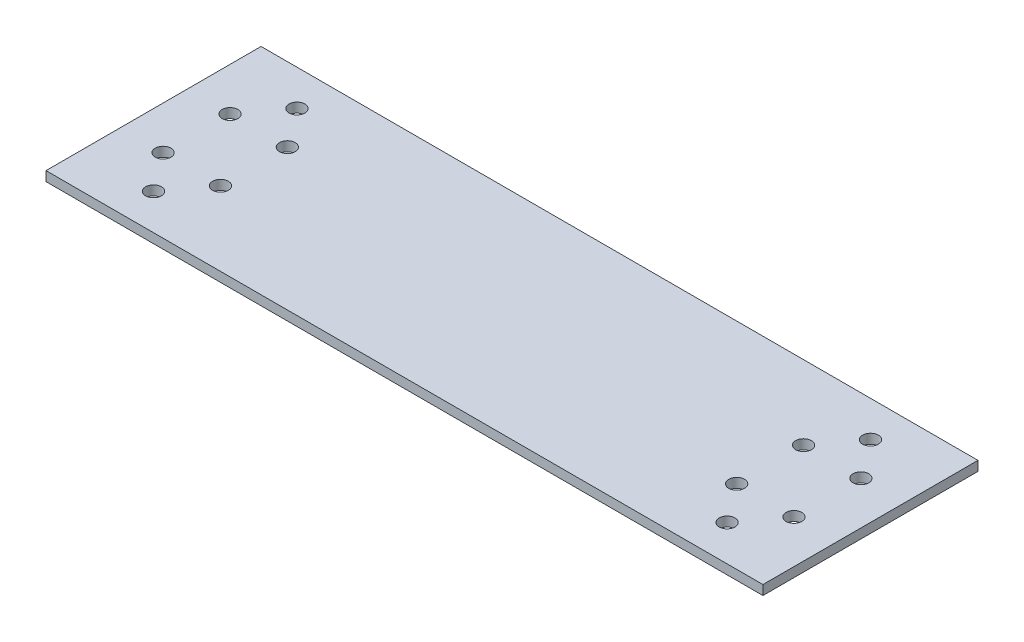
ISO-10303-21;
HEADER;
FILE_DESCRIPTION(('STEP AP214'),'2;1');
FILE_NAME('part.step','',(''),(''),'','','');
FILE_SCHEMA(('AUTOMOTIVE_DESIGN { 1 0 10303 214 1 1 1 1 }'));
ENDSEC;
DATA;
#1=APPLICATION_CONTEXT('core data for automotive mechanical design processes');
#2=APPLICATION_PROTOCOL_DEFINITION('international standard','automotive_design',2000,#1);
#3=PRODUCT_CONTEXT('',#1,'mechanical');
#4=PRODUCT('Part','Part','',(#3));
#5=PRODUCT_RELATED_PRODUCT_CATEGORY('part','',(#4));
#6=PRODUCT_DEFINITION_FORMATION('','',#4);
#7=PRODUCT_DEFINITION_CONTEXT('part definition',#1,'design');
#8=PRODUCT_DEFINITION('design','',#6,#7);
#9=PRODUCT_DEFINITION_SHAPE('','',#8);
#10=(LENGTH_UNIT() NAMED_UNIT(*) SI_UNIT(.MILLI.,.METRE.));
#11=(NAMED_UNIT(*) PLANE_ANGLE_UNIT() SI_UNIT($,.RADIAN.));
#12=(NAMED_UNIT(*) SI_UNIT($,.STERADIAN.) SOLID_ANGLE_UNIT());
#13=UNCERTAINTY_MEASURE_WITH_UNIT(LENGTH_MEASURE(1.E-05),#10,'distance_accuracy_value','');
#14=(GEOMETRIC_REPRESENTATION_CONTEXT(3) GLOBAL_UNCERTAINTY_ASSIGNED_CONTEXT((#13)) GLOBAL_UNIT_ASSIGNED_CONTEXT((#10,
#11,#12)) REPRESENTATION_CONTEXT('',''));
#15=CARTESIAN_POINT('',(0.,0.,0.));
#16=DIRECTION('',(0.,0.,1.));
#17=DIRECTION('',(1.,0.,0.));
#18=AXIS2_PLACEMENT_3D('',#15,#16,#17);
#19=CARTESIAN_POINT('',(75.,2.,22.5));
#20=DIRECTION('',(-1.,0.,0.));
#21=DIRECTION('',(0.,0.,1.));
#22=AXIS2_PLACEMENT_3D('',#19,#20,#21);
#23=PLANE('',#22);
#24=DIRECTION('',(0.,0.,-1.));
#25=VECTOR('',#24,1.);
#26=CARTESIAN_POINT('',(75.,0.,22.5));
#27=LINE('',#26,#25);
#28=CARTESIAN_POINT('',(75.,0.,22.5));
#29=VERTEX_POINT('',#28);
#30=CARTESIAN_POINT('',(75.,0.,-22.5));
#31=VERTEX_POINT('',#30);
#32=EDGE_CURVE('E98',#29,#31,#27,.T.);
#33=ORIENTED_EDGE('',*,*,#32,.T.);
#34=DIRECTION('',(0.,-1.,0.));
#35=VECTOR('',#34,1.);
#36=CARTESIAN_POINT('',(75.,2.,-22.5));
#37=LINE('',#36,#35);
#38=CARTESIAN_POINT('',(75.,2.,-22.5));
#39=VERTEX_POINT('',#38);
#40=EDGE_CURVE('E11',#39,#31,#37,.T.);
#41=ORIENTED_EDGE('',*,*,#40,.F.);
#42=DIRECTION('',(0.,0.,-1.));
#43=VECTOR('',#42,1.);
#44=CARTESIAN_POINT('',(75.,2.,22.5));
#45=LINE('',#44,#43);
#46=CARTESIAN_POINT('',(75.,2.,22.5));
#47=VERTEX_POINT('',#46);
#48=EDGE_CURVE('E86',#47,#39,#45,.T.);
#49=ORIENTED_EDGE('',*,*,#48,.F.);
#50=DIRECTION('',(0.,-1.,0.));
#51=VECTOR('',#50,1.);
#52=CARTESIAN_POINT('',(75.,2.,22.5));
#53=LINE('',#52,#51);
#54=EDGE_CURVE('E94',#47,#29,#53,.T.);
#55=ORIENTED_EDGE('',*,*,#54,.T.);
#56=EDGE_LOOP('',(#33,#41,#49,#55));
#57=FACE_BOUND('',#56,.T.);
#58=ADVANCED_FACE('F35',(#57),#23,.F.);
#59=CARTESIAN_POINT('',(-75.,2.,-22.5));
#60=DIRECTION('',(0.,0.,1.));
#61=DIRECTION('',(1.,0.,0.));
#62=AXIS2_PLACEMENT_3D('',#59,#60,#61);
#63=PLANE('',#62);
#64=DIRECTION('',(-1.,0.,0.));
#65=VECTOR('',#64,1.);
#66=CARTESIAN_POINT('',(-75.,0.,-22.5));
#67=LINE('',#66,#65);
#68=CARTESIAN_POINT('',(-75.,0.,-22.5));
#69=VERTEX_POINT('',#68);
#70=EDGE_CURVE('E90',#31,#69,#67,.T.);
#71=ORIENTED_EDGE('',*,*,#70,.T.);
#72=DIRECTION('',(0.,-1.,0.));
#73=VECTOR('',#72,1.);
#74=CARTESIAN_POINT('',(-75.,2.,-22.5));
#75=LINE('',#74,#73);
#76=CARTESIAN_POINT('',(-75.,2.,-22.5));
#77=VERTEX_POINT('',#76);
#78=EDGE_CURVE('E43',#77,#69,#75,.T.);
#79=ORIENTED_EDGE('',*,*,#78,.F.);
#80=DIRECTION('',(-1.,0.,0.));
#81=VECTOR('',#80,1.);
#82=CARTESIAN_POINT('',(-75.,2.,-22.5));
#83=LINE('',#82,#81);
#84=EDGE_CURVE('E81',#39,#77,#83,.T.);
#85=ORIENTED_EDGE('',*,*,#84,.F.);
#86=ORIENTED_EDGE('',*,*,#40,.T.);
#87=EDGE_LOOP('',(#71,#79,#85,#86));
#88=FACE_BOUND('',#87,.T.);
#89=ADVANCED_FACE('F89',(#88),#63,.F.);
#90=CARTESIAN_POINT('',(-75.,2.,22.5));
#91=DIRECTION('',(1.,0.,0.));
#92=DIRECTION('',(0.,0.,-1.));
#93=AXIS2_PLACEMENT_3D('',#90,#91,#92);
#94=PLANE('',#93);
#95=DIRECTION('',(0.,0.,1.));
#96=VECTOR('',#95,1.);
#97=CARTESIAN_POINT('',(-75.,0.,22.5));
#98=LINE('',#97,#96);
#99=CARTESIAN_POINT('',(-75.,0.,22.5));
#100=VERTEX_POINT('',#99);
#101=EDGE_CURVE('E68',#69,#100,#98,.T.);
#102=ORIENTED_EDGE('',*,*,#101,.T.);
#103=DIRECTION('',(0.,-1.,0.));
#104=VECTOR('',#103,1.);
#105=CARTESIAN_POINT('',(-75.,2.,22.5));
#106=LINE('',#105,#104);
#107=CARTESIAN_POINT('',(-75.,2.,22.5));
#108=VERTEX_POINT('',#107);
#109=EDGE_CURVE('E91',#108,#100,#106,.T.);
#110=ORIENTED_EDGE('',*,*,#109,.F.);
#111=DIRECTION('',(0.,0.,1.));
#112=VECTOR('',#111,1.);
#113=CARTESIAN_POINT('',(-75.,2.,22.5));
#114=LINE('',#113,#112);
#115=EDGE_CURVE('E84',#77,#108,#114,.T.);
#116=ORIENTED_EDGE('',*,*,#115,.F.);
#117=ORIENTED_EDGE('',*,*,#78,.T.);
#118=EDGE_LOOP('',(#102,#110,#116,#117));
#119=FACE_BOUND('',#118,.T.);
#120=ADVANCED_FACE('F92',(#119),#94,.F.);
#121=CARTESIAN_POINT('',(-75.,2.,22.5));
#122=DIRECTION('',(0.,0.,-1.));
#123=DIRECTION('',(-1.,0.,0.));
#124=AXIS2_PLACEMENT_3D('',#121,#122,#123);
#125=PLANE('',#124);
#126=DIRECTION('',(1.,0.,0.));
#127=VECTOR('',#126,1.);
#128=CARTESIAN_POINT('',(-75.,0.,22.5));
#129=LINE('',#128,#127);
#130=EDGE_CURVE('E74',#100,#29,#129,.T.);
#131=ORIENTED_EDGE('',*,*,#130,.T.);
#132=ORIENTED_EDGE('',*,*,#54,.F.);
#133=DIRECTION('',(1.,0.,0.));
#134=VECTOR('',#133,1.);
#135=CARTESIAN_POINT('',(-75.,2.,22.5));
#136=LINE('',#135,#134);
#137=EDGE_CURVE('E51',#108,#47,#136,.T.);
#138=ORIENTED_EDGE('',*,*,#137,.F.);
#139=ORIENTED_EDGE('',*,*,#109,.T.);
#140=EDGE_LOOP('',(#131,#132,#138,#139));
#141=FACE_BOUND('',#140,.T.);
#142=ADVANCED_FACE('F106',(#141),#125,.F.);
#143=CARTESIAN_POINT('',(0.,2.,0.));
#144=DIRECTION('',(0.,-1.,0.));
#145=DIRECTION('',(0.,0.,-1.));
#146=AXIS2_PLACEMENT_3D('',#143,#144,#145);
#147=PLANE('',#146);
#148=CARTESIAN_POINT('',(60.,2.,-15.));
#149=DIRECTION('',(0.,-1.,0.));
#150=DIRECTION('',(0.,0.,1.));
#151=AXIS2_PLACEMENT_3D('',#148,#149,#150);
#152=CIRCLE('',#151,1.64999999999999);
#153=CARTESIAN_POINT('',(60.,2.,-13.35));
#154=VERTEX_POINT('',#153);
#155=EDGE_CURVE('E176',#154,#154,#152,.T.);
#156=ORIENTED_EDGE('',*,*,#155,.T.);
#157=EDGE_LOOP('',(#156));
#158=FACE_BOUND('',#157,.T.);
#159=CARTESIAN_POINT('',(65.9999999999999,2.,-7.));
#160=DIRECTION('',(0.,-1.,0.));
#161=DIRECTION('',(0.,0.,1.));
#162=AXIS2_PLACEMENT_3D('',#159,#160,#161);
#163=CIRCLE('',#162,1.65);
#164=CARTESIAN_POINT('',(65.9999999999999,2.,-5.35));
#165=VERTEX_POINT('',#164);
#166=EDGE_CURVE('E169',#165,#165,#163,.T.);
#167=ORIENTED_EDGE('',*,*,#166,.T.);
#168=EDGE_LOOP('',(#167));
#169=FACE_BOUND('',#168,.T.);
#170=CARTESIAN_POINT('',(54.,2.,-7.));
#171=DIRECTION('',(0.,-1.,0.));
#172=DIRECTION('',(0.,0.,1.));
#173=AXIS2_PLACEMENT_3D('',#170,#171,#172);
#174=CIRCLE('',#173,1.65);
#175=CARTESIAN_POINT('',(54.,2.,-5.35));
#176=VERTEX_POINT('',#175);
#177=EDGE_CURVE('E170',#176,#176,#174,.T.);
#178=ORIENTED_EDGE('',*,*,#177,.T.);
#179=EDGE_LOOP('',(#178));
#180=FACE_BOUND('',#179,.T.);
#181=CARTESIAN_POINT('',(60.,2.,15.));
#182=DIRECTION('',(0.,1.,0.));
#183=DIRECTION('',(0.,0.,-1.));
#184=AXIS2_PLACEMENT_3D('',#181,#182,#183);
#185=CIRCLE('',#184,1.64999999999999);
#186=CARTESIAN_POINT('',(60.,2.,13.35));
#187=VERTEX_POINT('',#186);
#188=EDGE_CURVE('E137',#187,#187,#185,.T.);
#189=ORIENTED_EDGE('',*,*,#188,.F.);
#190=EDGE_LOOP('',(#189));
#191=FACE_BOUND('',#190,.T.);
#192=CARTESIAN_POINT('',(65.9999999999999,2.,7.));
#193=DIRECTION('',(0.,1.,0.));
#194=DIRECTION('',(0.,0.,-1.));
#195=AXIS2_PLACEMENT_3D('',#192,#193,#194);
#196=CIRCLE('',#195,1.65);
#197=CARTESIAN_POINT('',(65.9999999999999,2.,5.35));
#198=VERTEX_POINT('',#197);
#199=EDGE_CURVE('E158',#198,#198,#196,.T.);
#200=ORIENTED_EDGE('',*,*,#199,.F.);
#201=EDGE_LOOP('',(#200));
#202=FACE_BOUND('',#201,.T.);
#203=CARTESIAN_POINT('',(54.,2.,7.));
#204=DIRECTION('',(0.,1.,0.));
#205=DIRECTION('',(0.,0.,-1.));
#206=AXIS2_PLACEMENT_3D('',#203,#204,#205);
#207=CIRCLE('',#206,1.65);
#208=CARTESIAN_POINT('',(54.,2.,5.35));
#209=VERTEX_POINT('',#208);
#210=EDGE_CURVE('E151',#209,#209,#207,.T.);
#211=ORIENTED_EDGE('',*,*,#210,.F.);
#212=EDGE_LOOP('',(#211));
#213=FACE_BOUND('',#212,.T.);
#214=CARTESIAN_POINT('',(-60.,2.,15.));
#215=DIRECTION('',(0.,-1.,0.));
#216=DIRECTION('',(0.,0.,-1.));
#217=AXIS2_PLACEMENT_3D('',#214,#215,#216);
#218=CIRCLE('',#217,1.64999999999999);
#219=CARTESIAN_POINT('',(-60.,2.,13.35));
#220=VERTEX_POINT('',#219);
#221=EDGE_CURVE('E141',#220,#220,#218,.T.);
#222=ORIENTED_EDGE('',*,*,#221,.T.);
#223=EDGE_LOOP('',(#222));
#224=FACE_BOUND('',#223,.T.);
#225=CARTESIAN_POINT('',(-65.9999999999999,2.,7.));
#226=DIRECTION('',(0.,-1.,0.));
#227=DIRECTION('',(0.,0.,-1.));
#228=AXIS2_PLACEMENT_3D('',#225,#226,#227);
#229=CIRCLE('',#228,1.65);
#230=CARTESIAN_POINT('',(-65.9999999999999,2.,5.35));
#231=VERTEX_POINT('',#230);
#232=EDGE_CURVE('E133',#231,#231,#229,.T.);
#233=ORIENTED_EDGE('',*,*,#232,.T.);
#234=EDGE_LOOP('',(#233));
#235=FACE_BOUND('',#234,.T.);
#236=CARTESIAN_POINT('',(-54.,2.,7.));
#237=DIRECTION('',(0.,-1.,0.));
#238=DIRECTION('',(0.,0.,-1.));
#239=AXIS2_PLACEMENT_3D('',#236,#237,#238);
#240=CIRCLE('',#239,1.65);
#241=CARTESIAN_POINT('',(-54.,2.,5.35));
#242=VERTEX_POINT('',#241);
#243=EDGE_CURVE('E134',#242,#242,#240,.T.);
#244=ORIENTED_EDGE('',*,*,#243,.T.);
#245=EDGE_LOOP('',(#244));
#246=FACE_BOUND('',#245,.T.);
#247=CARTESIAN_POINT('',(-60.,2.,-15.));
#248=DIRECTION('',(0.,1.,0.));
#249=DIRECTION('',(0.,0.,1.));
#250=AXIS2_PLACEMENT_3D('',#247,#248,#249);
#251=CIRCLE('',#250,1.64999999999999);
#252=CARTESIAN_POINT('',(-60.,2.,-13.35));
#253=VERTEX_POINT('',#252);
#254=EDGE_CURVE('E101',#253,#253,#251,.T.);
#255=ORIENTED_EDGE('',*,*,#254,.F.);
#256=EDGE_LOOP('',(#255));
#257=FACE_BOUND('',#256,.T.);
#258=CARTESIAN_POINT('',(-65.9999999999999,2.,-7.));
#259=DIRECTION('',(0.,1.,0.));
#260=DIRECTION('',(0.,0.,1.));
#261=AXIS2_PLACEMENT_3D('',#258,#259,#260);
#262=CIRCLE('',#261,1.65);
#263=CARTESIAN_POINT('',(-65.9999999999999,2.,-5.35));
#264=VERTEX_POINT('',#263);
#265=EDGE_CURVE('E122',#264,#264,#262,.T.);
#266=ORIENTED_EDGE('',*,*,#265,.F.);
#267=EDGE_LOOP('',(#266));
#268=FACE_BOUND('',#267,.T.);
#269=CARTESIAN_POINT('',(-54.,2.,-7.));
#270=DIRECTION('',(0.,1.,0.));
#271=DIRECTION('',(0.,0.,1.));
#272=AXIS2_PLACEMENT_3D('',#269,#270,#271);
#273=CIRCLE('',#272,1.65);
#274=CARTESIAN_POINT('',(-54.,2.,-5.35));
#275=VERTEX_POINT('',#274);
#276=EDGE_CURVE('E115',#275,#275,#273,.T.);
#277=ORIENTED_EDGE('',*,*,#276,.F.);
#278=EDGE_LOOP('',(#277));
#279=FACE_BOUND('',#278,.T.);
#280=ORIENTED_EDGE('',*,*,#48,.T.);
#281=ORIENTED_EDGE('',*,*,#84,.T.);
#282=ORIENTED_EDGE('',*,*,#115,.T.);
#283=ORIENTED_EDGE('',*,*,#137,.T.);
#284=EDGE_LOOP('',(#280,#281,#282,#283));
#285=FACE_BOUND('',#284,.T.);
#286=ADVANCED_FACE('F82',(#158,#169,#180,#191,#202,#213,#224,#235,#246,#257,#268,#279,#285),
#147,.F.);
#287=CARTESIAN_POINT('',(0.,0.,0.));
#288=DIRECTION('',(0.,-1.,0.));
#289=DIRECTION('',(0.,0.,-1.));
#290=AXIS2_PLACEMENT_3D('',#287,#288,#289);
#291=PLANE('',#290);
#292=CARTESIAN_POINT('',(60.,0.,-15.));
#293=DIRECTION('',(0.,-1.,0.));
#294=DIRECTION('',(0.,0.,-1.));
#295=AXIS2_PLACEMENT_3D('',#292,#293,#294);
#296=CIRCLE('',#295,1.64999999999999);
#297=CARTESIAN_POINT('',(60.,0.,-16.65));
#298=VERTEX_POINT('',#297);
#299=EDGE_CURVE('E152',#298,#298,#296,.T.);
#300=ORIENTED_EDGE('',*,*,#299,.F.);
#301=EDGE_LOOP('',(#300));
#302=FACE_BOUND('',#301,.T.);
#303=CARTESIAN_POINT('',(65.9999999999999,0.,-7.));
#304=DIRECTION('',(0.,-1.,0.));
#305=DIRECTION('',(0.,0.,-1.));
#306=AXIS2_PLACEMENT_3D('',#303,#304,#305);
#307=CIRCLE('',#306,1.65);
#308=CARTESIAN_POINT('',(65.9999999999999,0.,-8.65));
#309=VERTEX_POINT('',#308);
#310=EDGE_CURVE('E173',#309,#309,#307,.T.);
#311=ORIENTED_EDGE('',*,*,#310,.F.);
#312=EDGE_LOOP('',(#311));
#313=FACE_BOUND('',#312,.T.);
#314=CARTESIAN_POINT('',(54.,0.,-7.));
#315=DIRECTION('',(0.,-1.,0.));
#316=DIRECTION('',(0.,0.,-1.));
#317=AXIS2_PLACEMENT_3D('',#314,#315,#316);
#318=CIRCLE('',#317,1.65);
#319=CARTESIAN_POINT('',(54.,0.,-8.65));
#320=VERTEX_POINT('',#319);
#321=EDGE_CURVE('E166',#320,#320,#318,.T.);
#322=ORIENTED_EDGE('',*,*,#321,.F.);
#323=EDGE_LOOP('',(#322));
#324=FACE_BOUND('',#323,.T.);
#325=CARTESIAN_POINT('',(60.,0.,15.));
#326=DIRECTION('',(0.,-1.,0.));
#327=DIRECTION('',(0.,0.,-1.));
#328=AXIS2_PLACEMENT_3D('',#325,#326,#327);
#329=CIRCLE('',#328,1.64999999999999);
#330=CARTESIAN_POINT('',(60.,0.,13.35));
#331=VERTEX_POINT('',#330);
#332=EDGE_CURVE('E161',#331,#331,#329,.F.);
#333=ORIENTED_EDGE('',*,*,#332,.T.);
#334=EDGE_LOOP('',(#333));
#335=FACE_BOUND('',#334,.T.);
#336=CARTESIAN_POINT('',(65.9999999999999,0.,7.));
#337=DIRECTION('',(0.,-1.,0.));
#338=DIRECTION('',(0.,0.,-1.));
#339=AXIS2_PLACEMENT_3D('',#336,#337,#338);
#340=CIRCLE('',#339,1.65);
#341=CARTESIAN_POINT('',(65.9999999999999,0.,5.35));
#342=VERTEX_POINT('',#341);
#343=EDGE_CURVE('E155',#342,#342,#340,.F.);
#344=ORIENTED_EDGE('',*,*,#343,.T.);
#345=EDGE_LOOP('',(#344));
#346=FACE_BOUND('',#345,.T.);
#347=CARTESIAN_POINT('',(54.,0.,7.));
#348=DIRECTION('',(0.,-1.,0.));
#349=DIRECTION('',(0.,0.,-1.));
#350=AXIS2_PLACEMENT_3D('',#347,#348,#349);
#351=CIRCLE('',#350,1.65);
#352=CARTESIAN_POINT('',(54.,0.,5.35));
#353=VERTEX_POINT('',#352);
#354=EDGE_CURVE('E148',#353,#353,#351,.F.);
#355=ORIENTED_EDGE('',*,*,#354,.T.);
#356=EDGE_LOOP('',(#355));
#357=FACE_BOUND('',#356,.T.);
#358=CARTESIAN_POINT('',(-60.,0.,15.));
#359=DIRECTION('',(0.,-1.,0.));
#360=DIRECTION('',(0.,0.,-1.));
#361=AXIS2_PLACEMENT_3D('',#358,#359,#360);
#362=CIRCLE('',#361,1.64999999999999);
#363=CARTESIAN_POINT('',(-60.,0.,13.35));
#364=VERTEX_POINT('',#363);
#365=EDGE_CURVE('E116',#364,#364,#362,.T.);
#366=ORIENTED_EDGE('',*,*,#365,.F.);
#367=EDGE_LOOP('',(#366));
#368=FACE_BOUND('',#367,.T.);
#369=CARTESIAN_POINT('',(-65.9999999999999,0.,7.));
#370=DIRECTION('',(0.,-1.,0.));
#371=DIRECTION('',(0.,0.,-1.));
#372=AXIS2_PLACEMENT_3D('',#369,#370,#371);
#373=CIRCLE('',#372,1.65);
#374=CARTESIAN_POINT('',(-65.9999999999999,0.,5.35));
#375=VERTEX_POINT('',#374);
#376=EDGE_CURVE('E138',#375,#375,#373,.T.);
#377=ORIENTED_EDGE('',*,*,#376,.F.);
#378=EDGE_LOOP('',(#377));
#379=FACE_BOUND('',#378,.T.);
#380=CARTESIAN_POINT('',(-54.,0.,7.));
#381=DIRECTION('',(0.,-1.,0.));
#382=DIRECTION('',(0.,0.,-1.));
#383=AXIS2_PLACEMENT_3D('',#380,#381,#382);
#384=CIRCLE('',#383,1.65);
#385=CARTESIAN_POINT('',(-54.,0.,5.35));
#386=VERTEX_POINT('',#385);
#387=EDGE_CURVE('E130',#386,#386,#384,.T.);
#388=ORIENTED_EDGE('',*,*,#387,.F.);
#389=EDGE_LOOP('',(#388));
#390=FACE_BOUND('',#389,.T.);
#391=CARTESIAN_POINT('',(-60.,0.,-15.));
#392=DIRECTION('',(0.,-1.,0.));
#393=DIRECTION('',(0.,0.,-1.));
#394=AXIS2_PLACEMENT_3D('',#391,#392,#393);
#395=CIRCLE('',#394,1.64999999999999);
#396=CARTESIAN_POINT('',(-60.,0.,-16.65));
#397=VERTEX_POINT('',#396);
#398=EDGE_CURVE('E125',#397,#397,#395,.F.);
#399=ORIENTED_EDGE('',*,*,#398,.T.);
#400=EDGE_LOOP('',(#399));
#401=FACE_BOUND('',#400,.T.);
#402=CARTESIAN_POINT('',(-65.9999999999999,0.,-7.));
#403=DIRECTION('',(0.,-1.,0.));
#404=DIRECTION('',(0.,0.,-1.));
#405=AXIS2_PLACEMENT_3D('',#402,#403,#404);
#406=CIRCLE('',#405,1.65);
#407=CARTESIAN_POINT('',(-65.9999999999999,0.,-8.65));
#408=VERTEX_POINT('',#407);
#409=EDGE_CURVE('E119',#408,#408,#406,.F.);
#410=ORIENTED_EDGE('',*,*,#409,.T.);
#411=EDGE_LOOP('',(#410));
#412=FACE_BOUND('',#411,.T.);
#413=CARTESIAN_POINT('',(-54.,0.,-7.));
#414=DIRECTION('',(0.,-1.,0.));
#415=DIRECTION('',(0.,0.,-1.));
#416=AXIS2_PLACEMENT_3D('',#413,#414,#415);
#417=CIRCLE('',#416,1.65);
#418=CARTESIAN_POINT('',(-54.,0.,-8.65));
#419=VERTEX_POINT('',#418);
#420=EDGE_CURVE('E112',#419,#419,#417,.F.);
#421=ORIENTED_EDGE('',*,*,#420,.T.);
#422=EDGE_LOOP('',(#421));
#423=FACE_BOUND('',#422,.T.);
#424=ORIENTED_EDGE('',*,*,#32,.F.);
#425=ORIENTED_EDGE('',*,*,#130,.F.);
#426=ORIENTED_EDGE('',*,*,#101,.F.);
#427=ORIENTED_EDGE('',*,*,#70,.F.);
#428=EDGE_LOOP('',(#424,#425,#426,#427));
#429=FACE_BOUND('',#428,.T.);
#430=ADVANCED_FACE('F109',(#302,#313,#324,#335,#346,#357,#368,#379,#390,#401,#412,#423,#429),
#291,.T.);
#431=CARTESIAN_POINT('',(-54.,-0.00100000000000013,-7.));
#432=DIRECTION('',(0.,1.,0.));
#433=DIRECTION('',(0.,0.,1.));
#434=AXIS2_PLACEMENT_3D('',#431,#432,#433);
#435=CYLINDRICAL_SURFACE('',#434,1.65);
#436=ORIENTED_EDGE('',*,*,#420,.F.);
#437=EDGE_LOOP('',(#436));
#438=FACE_BOUND('',#437,.T.);
#439=ORIENTED_EDGE('',*,*,#276,.T.);
#440=EDGE_LOOP('',(#439));
#441=FACE_BOUND('',#440,.T.);
#442=ADVANCED_FACE('F210',(#438,#441),#435,.F.);
#443=CARTESIAN_POINT('',(-65.9999999999999,-0.00100000000000013,-7.));
#444=DIRECTION('',(0.,1.,0.));
#445=DIRECTION('',(0.,0.,1.));
#446=AXIS2_PLACEMENT_3D('',#443,#444,#445);
#447=CYLINDRICAL_SURFACE('',#446,1.65);
#448=ORIENTED_EDGE('',*,*,#409,.F.);
#449=EDGE_LOOP('',(#448));
#450=FACE_BOUND('',#449,.T.);
#451=ORIENTED_EDGE('',*,*,#265,.T.);
#452=EDGE_LOOP('',(#451));
#453=FACE_BOUND('',#452,.T.);
#454=ADVANCED_FACE('F216',(#450,#453),#447,.F.);
#455=CARTESIAN_POINT('',(-60.,-0.00100000000000013,-15.));
#456=DIRECTION('',(0.,1.,0.));
#457=DIRECTION('',(0.,0.,1.));
#458=AXIS2_PLACEMENT_3D('',#455,#456,#457);
#459=CYLINDRICAL_SURFACE('',#458,1.64999999999999);
#460=ORIENTED_EDGE('',*,*,#398,.F.);
#461=EDGE_LOOP('',(#460));
#462=FACE_BOUND('',#461,.T.);
#463=ORIENTED_EDGE('',*,*,#254,.T.);
#464=EDGE_LOOP('',(#463));
#465=FACE_BOUND('',#464,.T.);
#466=ADVANCED_FACE('F220',(#462,#465),#459,.F.);
#467=CARTESIAN_POINT('',(-54.,-0.00100000000000013,7.));
#468=DIRECTION('',(0.,1.,0.));
#469=DIRECTION('',(0.,0.,1.));
#470=AXIS2_PLACEMENT_3D('',#467,#468,#469);
#471=CYLINDRICAL_SURFACE('',#470,1.65);
#472=ORIENTED_EDGE('',*,*,#387,.T.);
#473=EDGE_LOOP('',(#472));
#474=FACE_BOUND('',#473,.T.);
#475=ORIENTED_EDGE('',*,*,#243,.F.);
#476=EDGE_LOOP('',(#475));
#477=FACE_BOUND('',#476,.T.);
#478=ADVANCED_FACE('F224',(#474,#477),#471,.F.);
#479=CARTESIAN_POINT('',(-65.9999999999999,-0.00100000000000013,7.));
#480=DIRECTION('',(0.,1.,0.));
#481=DIRECTION('',(0.,0.,1.));
#482=AXIS2_PLACEMENT_3D('',#479,#480,#481);
#483=CYLINDRICAL_SURFACE('',#482,1.65);
#484=ORIENTED_EDGE('',*,*,#376,.T.);
#485=EDGE_LOOP('',(#484));
#486=FACE_BOUND('',#485,.T.);
#487=ORIENTED_EDGE('',*,*,#232,.F.);
#488=EDGE_LOOP('',(#487));
#489=FACE_BOUND('',#488,.T.);
#490=ADVANCED_FACE('F228',(#486,#489),#483,.F.);
#491=CARTESIAN_POINT('',(-60.,-0.00100000000000013,15.));
#492=DIRECTION('',(0.,1.,0.));
#493=DIRECTION('',(0.,0.,1.));
#494=AXIS2_PLACEMENT_3D('',#491,#492,#493);
#495=CYLINDRICAL_SURFACE('',#494,1.64999999999999);
#496=ORIENTED_EDGE('',*,*,#365,.T.);
#497=EDGE_LOOP('',(#496));
#498=FACE_BOUND('',#497,.T.);
#499=ORIENTED_EDGE('',*,*,#221,.F.);
#500=EDGE_LOOP('',(#499));
#501=FACE_BOUND('',#500,.T.);
#502=ADVANCED_FACE('F232',(#498,#501),#495,.F.);
#503=CARTESIAN_POINT('',(54.,-0.00100000000000013,7.));
#504=DIRECTION('',(0.,1.,0.));
#505=DIRECTION('',(0.,0.,1.));
#506=AXIS2_PLACEMENT_3D('',#503,#504,#505);
#507=CYLINDRICAL_SURFACE('',#506,1.65);
#508=ORIENTED_EDGE('',*,*,#354,.F.);
#509=EDGE_LOOP('',(#508));
#510=FACE_BOUND('',#509,.T.);
#511=ORIENTED_EDGE('',*,*,#210,.T.);
#512=EDGE_LOOP('',(#511));
#513=FACE_BOUND('',#512,.T.);
#514=ADVANCED_FACE('F236',(#510,#513),#507,.F.);
#515=CARTESIAN_POINT('',(65.9999999999999,-0.00100000000000013,7.));
#516=DIRECTION('',(0.,1.,0.));
#517=DIRECTION('',(0.,0.,1.));
#518=AXIS2_PLACEMENT_3D('',#515,#516,#517);
#519=CYLINDRICAL_SURFACE('',#518,1.65);
#520=ORIENTED_EDGE('',*,*,#343,.F.);
#521=EDGE_LOOP('',(#520));
#522=FACE_BOUND('',#521,.T.);
#523=ORIENTED_EDGE('',*,*,#199,.T.);
#524=EDGE_LOOP('',(#523));
#525=FACE_BOUND('',#524,.T.);
#526=ADVANCED_FACE('F240',(#522,#525),#519,.F.);
#527=CARTESIAN_POINT('',(60.,-0.00100000000000013,15.));
#528=DIRECTION('',(0.,1.,0.));
#529=DIRECTION('',(0.,0.,1.));
#530=AXIS2_PLACEMENT_3D('',#527,#528,#529);
#531=CYLINDRICAL_SURFACE('',#530,1.64999999999999);
#532=ORIENTED_EDGE('',*,*,#332,.F.);
#533=EDGE_LOOP('',(#532));
#534=FACE_BOUND('',#533,.T.);
#535=ORIENTED_EDGE('',*,*,#188,.T.);
#536=EDGE_LOOP('',(#535));
#537=FACE_BOUND('',#536,.T.);
#538=ADVANCED_FACE('F244',(#534,#537),#531,.F.);
#539=CARTESIAN_POINT('',(54.,-0.00100000000000013,-7.));
#540=DIRECTION('',(0.,1.,0.));
#541=DIRECTION('',(0.,0.,1.));
#542=AXIS2_PLACEMENT_3D('',#539,#540,#541);
#543=CYLINDRICAL_SURFACE('',#542,1.65);
#544=ORIENTED_EDGE('',*,*,#321,.T.);
#545=EDGE_LOOP('',(#544));
#546=FACE_BOUND('',#545,.T.);
#547=ORIENTED_EDGE('',*,*,#177,.F.);
#548=EDGE_LOOP('',(#547));
#549=FACE_BOUND('',#548,.T.);
#550=ADVANCED_FACE('F194',(#546,#549),#543,.F.);
#551=CARTESIAN_POINT('',(65.9999999999999,-0.00100000000000013,-7.));
#552=DIRECTION('',(0.,1.,0.));
#553=DIRECTION('',(0.,0.,1.));
#554=AXIS2_PLACEMENT_3D('',#551,#552,#553);
#555=CYLINDRICAL_SURFACE('',#554,1.65);
#556=ORIENTED_EDGE('',*,*,#310,.T.);
#557=EDGE_LOOP('',(#556));
#558=FACE_BOUND('',#557,.T.);
#559=ORIENTED_EDGE('',*,*,#166,.F.);
#560=EDGE_LOOP('',(#559));
#561=FACE_BOUND('',#560,.T.);
#562=ADVANCED_FACE('F188',(#558,#561),#555,.F.);
#563=CARTESIAN_POINT('',(60.,-0.00100000000000013,-15.));
#564=DIRECTION('',(0.,1.,0.));
#565=DIRECTION('',(0.,0.,1.));
#566=AXIS2_PLACEMENT_3D('',#563,#564,#565);
#567=CYLINDRICAL_SURFACE('',#566,1.64999999999999);
#568=ORIENTED_EDGE('',*,*,#299,.T.);
#569=EDGE_LOOP('',(#568));
#570=FACE_BOUND('',#569,.T.);
#571=ORIENTED_EDGE('',*,*,#155,.F.);
#572=EDGE_LOOP('',(#571));
#573=FACE_BOUND('',#572,.T.);
#574=ADVANCED_FACE('F186',(#570,#573),#567,.F.);
#575=CLOSED_SHELL('',(#58,#89,#120,#142,#286,#430,#442,#454,#466,#478,#490,#502,#514,#526,#538,
#550,#562,#574));
#576=MANIFOLD_SOLID_BREP('B2',#575);
#577=ADVANCED_BREP_SHAPE_REPRESENTATION('',(#18,#576),#14);
#578=SHAPE_DEFINITION_REPRESENTATION(#9,#577);
ENDSEC;
END-ISO-10303-21;
